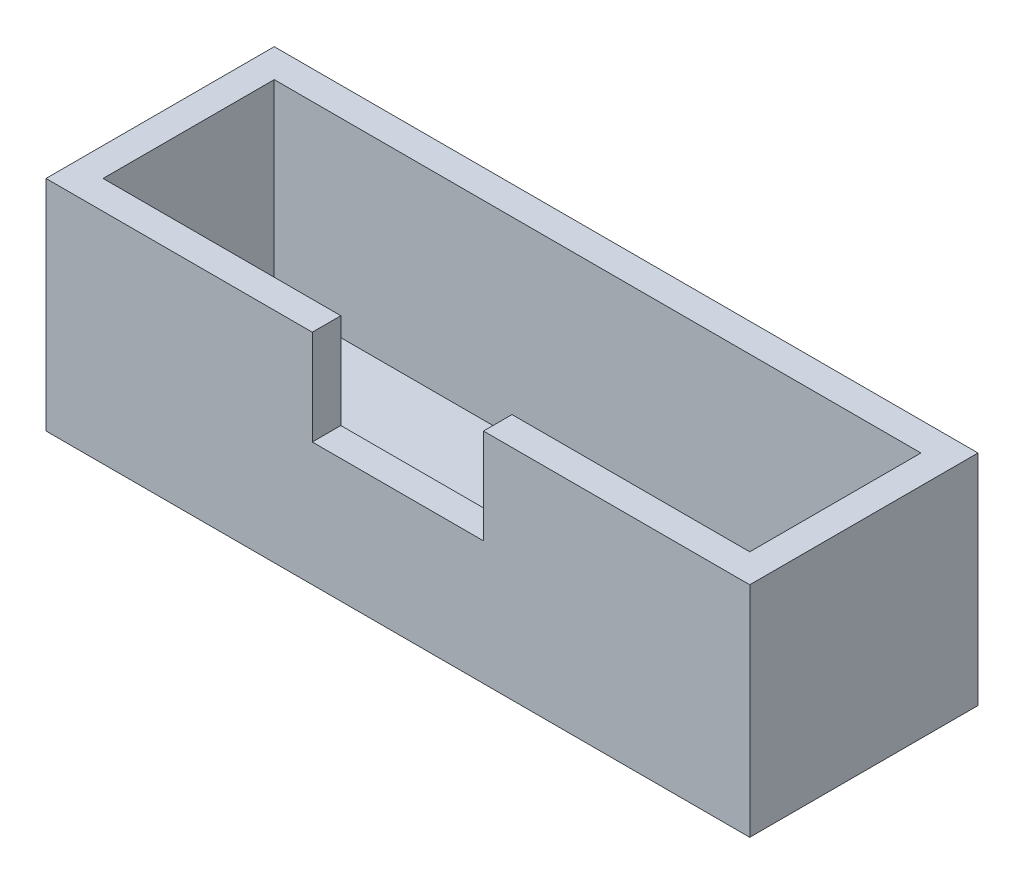
ISO-10303-21;
HEADER;
FILE_DESCRIPTION(('STEP AP214'),'2;1');
FILE_NAME('part.step','',(''),(''),'','','');
FILE_SCHEMA(('AUTOMOTIVE_DESIGN { 1 0 10303 214 1 1 1 1 }'));
ENDSEC;
DATA;
#1=APPLICATION_CONTEXT('core data for automotive mechanical design processes');
#2=APPLICATION_PROTOCOL_DEFINITION('international standard','automotive_design',2000,#1);
#3=PRODUCT_CONTEXT('',#1,'mechanical');
#4=PRODUCT('Part','Part','',(#3));
#5=PRODUCT_RELATED_PRODUCT_CATEGORY('part','',(#4));
#6=PRODUCT_DEFINITION_FORMATION('','',#4);
#7=PRODUCT_DEFINITION_CONTEXT('part definition',#1,'design');
#8=PRODUCT_DEFINITION('design','',#6,#7);
#9=PRODUCT_DEFINITION_SHAPE('','',#8);
#10=(LENGTH_UNIT() NAMED_UNIT(*) SI_UNIT(.MILLI.,.METRE.));
#11=(NAMED_UNIT(*) PLANE_ANGLE_UNIT() SI_UNIT($,.RADIAN.));
#12=(NAMED_UNIT(*) SI_UNIT($,.STERADIAN.) SOLID_ANGLE_UNIT());
#13=UNCERTAINTY_MEASURE_WITH_UNIT(LENGTH_MEASURE(1.E-05),#10,'distance_accuracy_value','');
#14=(GEOMETRIC_REPRESENTATION_CONTEXT(3) GLOBAL_UNCERTAINTY_ASSIGNED_CONTEXT((#13)) GLOBAL_UNIT_ASSIGNED_CONTEXT((#10,
#11,#12)) REPRESENTATION_CONTEXT('',''));
#15=CARTESIAN_POINT('',(0.,0.,0.));
#16=DIRECTION('',(0.,0.,1.));
#17=DIRECTION('',(1.,0.,0.));
#18=AXIS2_PLACEMENT_3D('',#15,#16,#17);
#19=CARTESIAN_POINT('',(0.,20.,0.));
#20=DIRECTION('',(0.,1.,0.));
#21=DIRECTION('',(0.,0.,1.));
#22=AXIS2_PLACEMENT_3D('',#19,#20,#21);
#23=PLANE('',#22);
#24=DIRECTION('',(0.,0.,-1.));
#25=VECTOR('',#24,1.);
#26=CARTESIAN_POINT('',(5.91228070175437,20.,24.3378421052632));
#27=LINE('',#26,#25);
#28=CARTESIAN_POINT('',(5.91228070175437,20.,24.3368421052632));
#29=VERTEX_POINT('',#28);
#30=CARTESIAN_POINT('',(5.91228070175437,20.,21.3368421052632));
#31=VERTEX_POINT('',#30);
#32=EDGE_CURVE('E125',#29,#31,#27,.T.);
#33=ORIENTED_EDGE('',*,*,#32,.T.);
#34=DIRECTION('',(1.,0.,0.));
#35=VECTOR('',#34,1.);
#36=CARTESIAN_POINT('',(-19.0877192982456,20.,21.3368421052632));
#37=LINE('',#36,#35);
#38=CARTESIAN_POINT('',(-19.0877192982456,20.,21.3368421052632));
#39=VERTEX_POINT('',#38);
#40=EDGE_CURVE('E195',#39,#31,#37,.T.);
#41=ORIENTED_EDGE('',*,*,#40,.F.);
#42=DIRECTION('',(0.,0.,1.));
#43=VECTOR('',#42,1.);
#44=CARTESIAN_POINT('',(-19.0877192982456,20.,3.33684210526316));
#45=LINE('',#44,#43);
#46=CARTESIAN_POINT('',(-19.0877192982456,20.,3.33684210526316));
#47=VERTEX_POINT('',#46);
#48=EDGE_CURVE('E191',#47,#39,#45,.T.);
#49=ORIENTED_EDGE('',*,*,#48,.F.);
#50=DIRECTION('',(-1.,0.,0.));
#51=VECTOR('',#50,1.);
#52=CARTESIAN_POINT('',(-19.0877192982456,20.,3.33684210526316));
#53=LINE('',#52,#51);
#54=CARTESIAN_POINT('',(48.9122807017544,20.,3.33684210526316));
#55=VERTEX_POINT('',#54);
#56=EDGE_CURVE('E199',#55,#47,#53,.T.);
#57=ORIENTED_EDGE('',*,*,#56,.F.);
#58=DIRECTION('',(0.,0.,-1.));
#59=VECTOR('',#58,1.);
#60=CARTESIAN_POINT('',(48.9122807017544,20.,3.33684210526316));
#61=LINE('',#60,#59);
#62=CARTESIAN_POINT('',(48.9122807017544,20.,21.3368421052632));
#63=VERTEX_POINT('',#62);
#64=EDGE_CURVE('E197',#63,#55,#61,.T.);
#65=ORIENTED_EDGE('',*,*,#64,.F.);
#66=CARTESIAN_POINT('',(23.9122807017544,20.,21.3368421052632));
#67=VERTEX_POINT('',#66);
#68=EDGE_CURVE('E193',#67,#63,#37,.T.);
#69=ORIENTED_EDGE('',*,*,#68,.F.);
#70=DIRECTION('',(0.,0.,-1.));
#71=VECTOR('',#70,1.);
#72=CARTESIAN_POINT('',(23.9122807017544,20.,24.3378421052632));
#73=LINE('',#72,#71);
#74=CARTESIAN_POINT('',(23.9122807017544,20.,24.3368421052632));
#75=VERTEX_POINT('',#74);
#76=EDGE_CURVE('E51',#75,#67,#73,.T.);
#77=ORIENTED_EDGE('',*,*,#76,.F.);
#78=DIRECTION('',(1.,0.,0.));
#79=VECTOR('',#78,1.);
#80=CARTESIAN_POINT('',(-22.0877192982456,20.,24.3368421052632));
#81=LINE('',#80,#79);
#82=CARTESIAN_POINT('',(51.9122807017544,20.,24.3368421052632));
#83=VERTEX_POINT('',#82);
#84=EDGE_CURVE('E150',#75,#83,#81,.T.);
#85=ORIENTED_EDGE('',*,*,#84,.T.);
#86=DIRECTION('',(0.,0.,-1.));
#87=VECTOR('',#86,1.);
#88=CARTESIAN_POINT('',(51.9122807017544,20.,0.336842105263163));
#89=LINE('',#88,#87);
#90=CARTESIAN_POINT('',(51.9122807017544,20.,0.336842105263163));
#91=VERTEX_POINT('',#90);
#92=EDGE_CURVE('E149',#83,#91,#89,.T.);
#93=ORIENTED_EDGE('',*,*,#92,.T.);
#94=DIRECTION('',(-1.,0.,0.));
#95=VECTOR('',#94,1.);
#96=CARTESIAN_POINT('',(-22.0877192982456,20.,0.336842105263163));
#97=LINE('',#96,#95);
#98=CARTESIAN_POINT('',(-22.0877192982456,20.,0.336842105263163));
#99=VERTEX_POINT('',#98);
#100=EDGE_CURVE('E152',#91,#99,#97,.T.);
#101=ORIENTED_EDGE('',*,*,#100,.T.);
#102=DIRECTION('',(0.,0.,1.));
#103=VECTOR('',#102,1.);
#104=CARTESIAN_POINT('',(-22.0877192982456,20.,0.336842105263163));
#105=LINE('',#104,#103);
#106=CARTESIAN_POINT('',(-22.0877192982456,20.,24.3368421052632));
#107=VERTEX_POINT('',#106);
#108=EDGE_CURVE('E147',#99,#107,#105,.T.);
#109=ORIENTED_EDGE('',*,*,#108,.T.);
#110=EDGE_CURVE('E140',#107,#29,#81,.T.);
#111=ORIENTED_EDGE('',*,*,#110,.T.);
#112=EDGE_LOOP('',(#33,#41,#49,#57,#65,#69,#77,#85,#93,#101,#109,#111));
#113=FACE_BOUND('',#112,.T.);
#114=ADVANCED_FACE('F36',(#113),#23,.T.);
#115=CARTESIAN_POINT('',(-22.0877192982456,20.,0.336842105263163));
#116=DIRECTION('',(1.,0.,0.));
#117=DIRECTION('',(0.,0.,-1.));
#118=AXIS2_PLACEMENT_3D('',#115,#116,#117);
#119=PLANE('',#118);
#120=DIRECTION('',(0.,-1.,0.));
#121=VECTOR('',#120,1.);
#122=CARTESIAN_POINT('',(-22.0877192982456,20.,0.336842105263163));
#123=LINE('',#122,#121);
#124=CARTESIAN_POINT('',(-22.0877192982456,-3.,0.336842105263163));
#125=VERTEX_POINT('',#124);
#126=EDGE_CURVE('E158',#99,#125,#123,.T.);
#127=ORIENTED_EDGE('',*,*,#126,.T.);
#128=DIRECTION('',(0.,0.,1.));
#129=VECTOR('',#128,1.);
#130=CARTESIAN_POINT('',(-22.0877192982456,-3.,0.));
#131=LINE('',#130,#129);
#132=CARTESIAN_POINT('',(-22.0877192982456,-3.,24.3368421052632));
#133=VERTEX_POINT('',#132);
#134=EDGE_CURVE('E183',#125,#133,#131,.T.);
#135=ORIENTED_EDGE('',*,*,#134,.T.);
#136=DIRECTION('',(0.,-1.,0.));
#137=VECTOR('',#136,1.);
#138=CARTESIAN_POINT('',(-22.0877192982456,20.,24.3368421052632));
#139=LINE('',#138,#137);
#140=EDGE_CURVE('E11',#107,#133,#139,.T.);
#141=ORIENTED_EDGE('',*,*,#140,.F.);
#142=ORIENTED_EDGE('',*,*,#108,.F.);
#143=EDGE_LOOP('',(#127,#135,#141,#142));
#144=FACE_BOUND('',#143,.T.);
#145=ADVANCED_FACE('F38',(#144),#119,.F.);
#146=CARTESIAN_POINT('',(-22.0877192982456,20.,24.3368421052632));
#147=DIRECTION('',(0.,0.,-1.));
#148=DIRECTION('',(-1.,0.,0.));
#149=AXIS2_PLACEMENT_3D('',#146,#147,#148);
#150=PLANE('',#149);
#151=DIRECTION('',(1.,0.,0.));
#152=VECTOR('',#151,1.);
#153=CARTESIAN_POINT('',(5.91228070175437,10.,24.3368421052632));
#154=LINE('',#153,#152);
#155=CARTESIAN_POINT('',(5.91228070175437,10.,24.3368421052632));
#156=VERTEX_POINT('',#155);
#157=CARTESIAN_POINT('',(23.9122807017544,10.,24.3368421052632));
#158=VERTEX_POINT('',#157);
#159=EDGE_CURVE('E144',#156,#158,#154,.T.);
#160=ORIENTED_EDGE('',*,*,#159,.F.);
#161=DIRECTION('',(0.,-1.,0.));
#162=VECTOR('',#161,1.);
#163=CARTESIAN_POINT('',(5.91228070175437,20.,24.3368421052632));
#164=LINE('',#163,#162);
#165=EDGE_CURVE('E128',#29,#156,#164,.T.);
#166=ORIENTED_EDGE('',*,*,#165,.F.);
#167=ORIENTED_EDGE('',*,*,#110,.F.);
#168=ORIENTED_EDGE('',*,*,#140,.T.);
#169=DIRECTION('',(1.,0.,0.));
#170=VECTOR('',#169,1.);
#171=CARTESIAN_POINT('',(0.,-3.,24.3368421052632));
#172=LINE('',#171,#170);
#173=CARTESIAN_POINT('',(51.9122807017544,-3.,24.3368421052632));
#174=VERTEX_POINT('',#173);
#175=EDGE_CURVE('E176',#133,#174,#172,.T.);
#176=ORIENTED_EDGE('',*,*,#175,.T.);
#177=DIRECTION('',(0.,-1.,0.));
#178=VECTOR('',#177,1.);
#179=CARTESIAN_POINT('',(51.9122807017544,20.,24.3368421052632));
#180=LINE('',#179,#178);
#181=EDGE_CURVE('E44',#83,#174,#180,.T.);
#182=ORIENTED_EDGE('',*,*,#181,.F.);
#183=ORIENTED_EDGE('',*,*,#84,.F.);
#184=DIRECTION('',(0.,1.,0.));
#185=VECTOR('',#184,1.);
#186=CARTESIAN_POINT('',(23.9122807017544,20.,24.3368421052632));
#187=LINE('',#186,#185);
#188=EDGE_CURVE('E373',#158,#75,#187,.T.);
#189=ORIENTED_EDGE('',*,*,#188,.F.);
#190=EDGE_LOOP('',(#160,#166,#167,#168,#176,#182,#183,#189));
#191=FACE_BOUND('',#190,.T.);
#192=ADVANCED_FACE('F139',(#191),#150,.F.);
#193=CARTESIAN_POINT('',(51.9122807017544,20.,0.336842105263163));
#194=DIRECTION('',(-1.,0.,0.));
#195=DIRECTION('',(0.,0.,1.));
#196=AXIS2_PLACEMENT_3D('',#193,#194,#195);
#197=PLANE('',#196);
#198=ORIENTED_EDGE('',*,*,#181,.T.);
#199=DIRECTION('',(0.,0.,1.));
#200=VECTOR('',#199,1.);
#201=CARTESIAN_POINT('',(51.9122807017544,-3.,0.));
#202=LINE('',#201,#200);
#203=CARTESIAN_POINT('',(51.9122807017544,-3.,0.336842105263163));
#204=VERTEX_POINT('',#203);
#205=EDGE_CURVE('E168',#204,#174,#202,.T.);
#206=ORIENTED_EDGE('',*,*,#205,.F.);
#207=DIRECTION('',(0.,-1.,0.));
#208=VECTOR('',#207,1.);
#209=CARTESIAN_POINT('',(51.9122807017544,20.,0.336842105263163));
#210=LINE('',#209,#208);
#211=EDGE_CURVE('E160',#91,#204,#210,.T.);
#212=ORIENTED_EDGE('',*,*,#211,.F.);
#213=ORIENTED_EDGE('',*,*,#92,.F.);
#214=EDGE_LOOP('',(#198,#206,#212,#213));
#215=FACE_BOUND('',#214,.T.);
#216=ADVANCED_FACE('F166',(#215),#197,.F.);
#217=CARTESIAN_POINT('',(-22.0877192982456,20.,0.336842105263163));
#218=DIRECTION('',(0.,0.,1.));
#219=DIRECTION('',(1.,0.,0.));
#220=AXIS2_PLACEMENT_3D('',#217,#218,#219);
#221=PLANE('',#220);
#222=ORIENTED_EDGE('',*,*,#211,.T.);
#223=DIRECTION('',(1.,0.,0.));
#224=VECTOR('',#223,1.);
#225=CARTESIAN_POINT('',(0.,-3.,0.336842105263163));
#226=LINE('',#225,#224);
#227=EDGE_CURVE('E178',#125,#204,#226,.T.);
#228=ORIENTED_EDGE('',*,*,#227,.F.);
#229=ORIENTED_EDGE('',*,*,#126,.F.);
#230=ORIENTED_EDGE('',*,*,#100,.F.);
#231=EDGE_LOOP('',(#222,#228,#229,#230));
#232=FACE_BOUND('',#231,.T.);
#233=ADVANCED_FACE('F262',(#232),#221,.F.);
#234=CARTESIAN_POINT('',(-19.0877192982456,20.,3.33684210526316));
#235=DIRECTION('',(1.,0.,0.));
#236=DIRECTION('',(0.,0.,-1.));
#237=AXIS2_PLACEMENT_3D('',#234,#235,#236);
#238=PLANE('',#237);
#239=DIRECTION('',(0.,0.,1.));
#240=VECTOR('',#239,1.);
#241=CARTESIAN_POINT('',(-19.0877192982456,0.,3.33684210526316));
#242=LINE('',#241,#240);
#243=CARTESIAN_POINT('',(-19.0877192982456,0.,3.33684210526316));
#244=VERTEX_POINT('',#243);
#245=CARTESIAN_POINT('',(-19.0877192982456,0.,21.3368421052632));
#246=VERTEX_POINT('',#245);
#247=EDGE_CURVE('E182',#244,#246,#242,.T.);
#248=ORIENTED_EDGE('',*,*,#247,.F.);
#249=DIRECTION('',(0.,-1.,0.));
#250=VECTOR('',#249,1.);
#251=CARTESIAN_POINT('',(-19.0877192982456,20.,3.33684210526316));
#252=LINE('',#251,#250);
#253=EDGE_CURVE('E200',#47,#244,#252,.T.);
#254=ORIENTED_EDGE('',*,*,#253,.F.);
#255=ORIENTED_EDGE('',*,*,#48,.T.);
#256=DIRECTION('',(0.,-1.,0.));
#257=VECTOR('',#256,1.);
#258=CARTESIAN_POINT('',(-19.0877192982456,20.,21.3368421052632));
#259=LINE('',#258,#257);
#260=EDGE_CURVE('E212',#39,#246,#259,.T.);
#261=ORIENTED_EDGE('',*,*,#260,.T.);
#262=EDGE_LOOP('',(#248,#254,#255,#261));
#263=FACE_BOUND('',#262,.T.);
#264=ADVANCED_FACE('F217',(#263),#238,.T.);
#265=CARTESIAN_POINT('',(-19.0877192982456,20.,21.3368421052632));
#266=DIRECTION('',(0.,0.,-1.));
#267=DIRECTION('',(-1.,0.,0.));
#268=AXIS2_PLACEMENT_3D('',#265,#266,#267);
#269=PLANE('',#268);
#270=DIRECTION('',(0.,1.,0.));
#271=VECTOR('',#270,1.);
#272=CARTESIAN_POINT('',(5.91228070175437,20.,21.3368421052632));
#273=LINE('',#272,#271);
#274=CARTESIAN_POINT('',(5.91228070175437,10.,21.3368421052632));
#275=VERTEX_POINT('',#274);
#276=EDGE_CURVE('E131',#275,#31,#273,.T.);
#277=ORIENTED_EDGE('',*,*,#276,.F.);
#278=DIRECTION('',(-1.,0.,0.));
#279=VECTOR('',#278,1.);
#280=CARTESIAN_POINT('',(5.91228070175437,10.,21.3368421052632));
#281=LINE('',#280,#279);
#282=CARTESIAN_POINT('',(23.9122807017544,10.,21.3368421052632));
#283=VERTEX_POINT('',#282);
#284=EDGE_CURVE('E136',#283,#275,#281,.T.);
#285=ORIENTED_EDGE('',*,*,#284,.F.);
#286=DIRECTION('',(0.,-1.,0.));
#287=VECTOR('',#286,1.);
#288=CARTESIAN_POINT('',(23.9122807017544,20.,21.3368421052632));
#289=LINE('',#288,#287);
#290=EDGE_CURVE('E230',#67,#283,#289,.T.);
#291=ORIENTED_EDGE('',*,*,#290,.F.);
#292=ORIENTED_EDGE('',*,*,#68,.T.);
#293=DIRECTION('',(0.,-1.,0.));
#294=VECTOR('',#293,1.);
#295=CARTESIAN_POINT('',(48.9122807017544,20.,21.3368421052632));
#296=LINE('',#295,#294);
#297=CARTESIAN_POINT('',(48.9122807017544,0.,21.3368421052632));
#298=VERTEX_POINT('',#297);
#299=EDGE_CURVE('E211',#63,#298,#296,.T.);
#300=ORIENTED_EDGE('',*,*,#299,.T.);
#301=DIRECTION('',(1.,0.,0.));
#302=VECTOR('',#301,1.);
#303=CARTESIAN_POINT('',(-19.0877192982456,0.,21.3368421052632));
#304=LINE('',#303,#302);
#305=EDGE_CURVE('E186',#246,#298,#304,.T.);
#306=ORIENTED_EDGE('',*,*,#305,.F.);
#307=ORIENTED_EDGE('',*,*,#260,.F.);
#308=ORIENTED_EDGE('',*,*,#40,.T.);
#309=EDGE_LOOP('',(#277,#285,#291,#292,#300,#306,#307,#308));
#310=FACE_BOUND('',#309,.T.);
#311=ADVANCED_FACE('F227',(#310),#269,.T.);
#312=CARTESIAN_POINT('',(48.9122807017544,20.,3.33684210526316));
#313=DIRECTION('',(-1.,0.,0.));
#314=DIRECTION('',(0.,0.,1.));
#315=AXIS2_PLACEMENT_3D('',#312,#313,#314);
#316=PLANE('',#315);
#317=DIRECTION('',(0.,0.,-1.));
#318=VECTOR('',#317,1.);
#319=CARTESIAN_POINT('',(48.9122807017544,0.,3.33684210526316));
#320=LINE('',#319,#318);
#321=CARTESIAN_POINT('',(48.9122807017544,0.,3.33684210526316));
#322=VERTEX_POINT('',#321);
#323=EDGE_CURVE('E204',#298,#322,#320,.T.);
#324=ORIENTED_EDGE('',*,*,#323,.F.);
#325=ORIENTED_EDGE('',*,*,#299,.F.);
#326=ORIENTED_EDGE('',*,*,#64,.T.);
#327=DIRECTION('',(0.,-1.,0.));
#328=VECTOR('',#327,1.);
#329=CARTESIAN_POINT('',(48.9122807017544,20.,3.33684210526316));
#330=LINE('',#329,#328);
#331=EDGE_CURVE('E59',#55,#322,#330,.T.);
#332=ORIENTED_EDGE('',*,*,#331,.T.);
#333=EDGE_LOOP('',(#324,#325,#326,#332));
#334=FACE_BOUND('',#333,.T.);
#335=ADVANCED_FACE('F245',(#334),#316,.T.);
#336=CARTESIAN_POINT('',(-19.0877192982456,20.,3.33684210526316));
#337=DIRECTION('',(0.,0.,1.));
#338=DIRECTION('',(1.,0.,0.));
#339=AXIS2_PLACEMENT_3D('',#336,#337,#338);
#340=PLANE('',#339);
#341=DIRECTION('',(-1.,0.,0.));
#342=VECTOR('',#341,1.);
#343=CARTESIAN_POINT('',(-19.0877192982456,0.,3.33684210526316));
#344=LINE('',#343,#342);
#345=EDGE_CURVE('E194',#322,#244,#344,.T.);
#346=ORIENTED_EDGE('',*,*,#345,.F.);
#347=ORIENTED_EDGE('',*,*,#331,.F.);
#348=ORIENTED_EDGE('',*,*,#56,.T.);
#349=ORIENTED_EDGE('',*,*,#253,.T.);
#350=EDGE_LOOP('',(#346,#347,#348,#349));
#351=FACE_BOUND('',#350,.T.);
#352=ADVANCED_FACE('F224',(#351),#340,.T.);
#353=CARTESIAN_POINT('',(0.,0.,0.));
#354=DIRECTION('',(0.,1.,0.));
#355=DIRECTION('',(0.,0.,1.));
#356=AXIS2_PLACEMENT_3D('',#353,#354,#355);
#357=PLANE('',#356);
#358=ORIENTED_EDGE('',*,*,#345,.T.);
#359=ORIENTED_EDGE('',*,*,#247,.T.);
#360=ORIENTED_EDGE('',*,*,#305,.T.);
#361=ORIENTED_EDGE('',*,*,#323,.T.);
#362=EDGE_LOOP('',(#358,#359,#360,#361));
#363=FACE_BOUND('',#362,.T.);
#364=ADVANCED_FACE('F222',(#363),#357,.T.);
#365=CARTESIAN_POINT('',(0.,-3.,0.));
#366=DIRECTION('',(0.,1.,0.));
#367=DIRECTION('',(0.,0.,1.));
#368=AXIS2_PLACEMENT_3D('',#365,#366,#367);
#369=PLANE('',#368);
#370=ORIENTED_EDGE('',*,*,#205,.T.);
#371=ORIENTED_EDGE('',*,*,#175,.F.);
#372=ORIENTED_EDGE('',*,*,#134,.F.);
#373=ORIENTED_EDGE('',*,*,#227,.T.);
#374=EDGE_LOOP('',(#370,#371,#372,#373));
#375=FACE_BOUND('',#374,.T.);
#376=ADVANCED_FACE('F174',(#375),#369,.F.);
#377=CARTESIAN_POINT('',(5.91228070175437,20.,24.3378421052632));
#378=DIRECTION('',(-1.,0.,0.));
#379=DIRECTION('',(0.,-1.,0.));
#380=AXIS2_PLACEMENT_3D('',#377,#378,#379);
#381=PLANE('',#380);
#382=ORIENTED_EDGE('',*,*,#165,.T.);
#383=DIRECTION('',(0.,0.,-1.));
#384=VECTOR('',#383,1.);
#385=CARTESIAN_POINT('',(5.91228070175437,10.,24.3378421052632));
#386=LINE('',#385,#384);
#387=EDGE_CURVE('E179',#156,#275,#386,.T.);
#388=ORIENTED_EDGE('',*,*,#387,.T.);
#389=ORIENTED_EDGE('',*,*,#276,.T.);
#390=ORIENTED_EDGE('',*,*,#32,.F.);
#391=EDGE_LOOP('',(#382,#388,#389,#390));
#392=FACE_BOUND('',#391,.T.);
#393=ADVANCED_FACE('F127',(#392),#381,.F.);
#394=CARTESIAN_POINT('',(5.91228070175437,10.,24.3378421052632));
#395=DIRECTION('',(0.,-1.,0.));
#396=DIRECTION('',(1.,0.,0.));
#397=AXIS2_PLACEMENT_3D('',#394,#395,#396);
#398=PLANE('',#397);
#399=ORIENTED_EDGE('',*,*,#159,.T.);
#400=DIRECTION('',(0.,0.,-1.));
#401=VECTOR('',#400,1.);
#402=CARTESIAN_POINT('',(23.9122807017544,10.,24.3378421052632));
#403=LINE('',#402,#401);
#404=EDGE_CURVE('E237',#158,#283,#403,.T.);
#405=ORIENTED_EDGE('',*,*,#404,.T.);
#406=ORIENTED_EDGE('',*,*,#284,.T.);
#407=ORIENTED_EDGE('',*,*,#387,.F.);
#408=EDGE_LOOP('',(#399,#405,#406,#407));
#409=FACE_BOUND('',#408,.T.);
#410=ADVANCED_FACE('F240',(#409),#398,.F.);
#411=CARTESIAN_POINT('',(23.9122807017544,20.,24.3378421052632));
#412=DIRECTION('',(1.,0.,0.));
#413=DIRECTION('',(0.,0.,-1.));
#414=AXIS2_PLACEMENT_3D('',#411,#412,#413);
#415=PLANE('',#414);
#416=ORIENTED_EDGE('',*,*,#188,.T.);
#417=ORIENTED_EDGE('',*,*,#76,.T.);
#418=ORIENTED_EDGE('',*,*,#290,.T.);
#419=ORIENTED_EDGE('',*,*,#404,.F.);
#420=EDGE_LOOP('',(#416,#417,#418,#419));
#421=FACE_BOUND('',#420,.T.);
#422=ADVANCED_FACE('F241',(#421),#415,.F.);
#423=CLOSED_SHELL('',(#114,#145,#192,#216,#233,#264,#311,#335,#352,#364,#376,#393,#410,#422));
#424=MANIFOLD_SOLID_BREP('B2',#423);
#425=ADVANCED_BREP_SHAPE_REPRESENTATION('',(#18,#424),#14);
#426=SHAPE_DEFINITION_REPRESENTATION(#9,#425);
ENDSEC;
END-ISO-10303-21;
